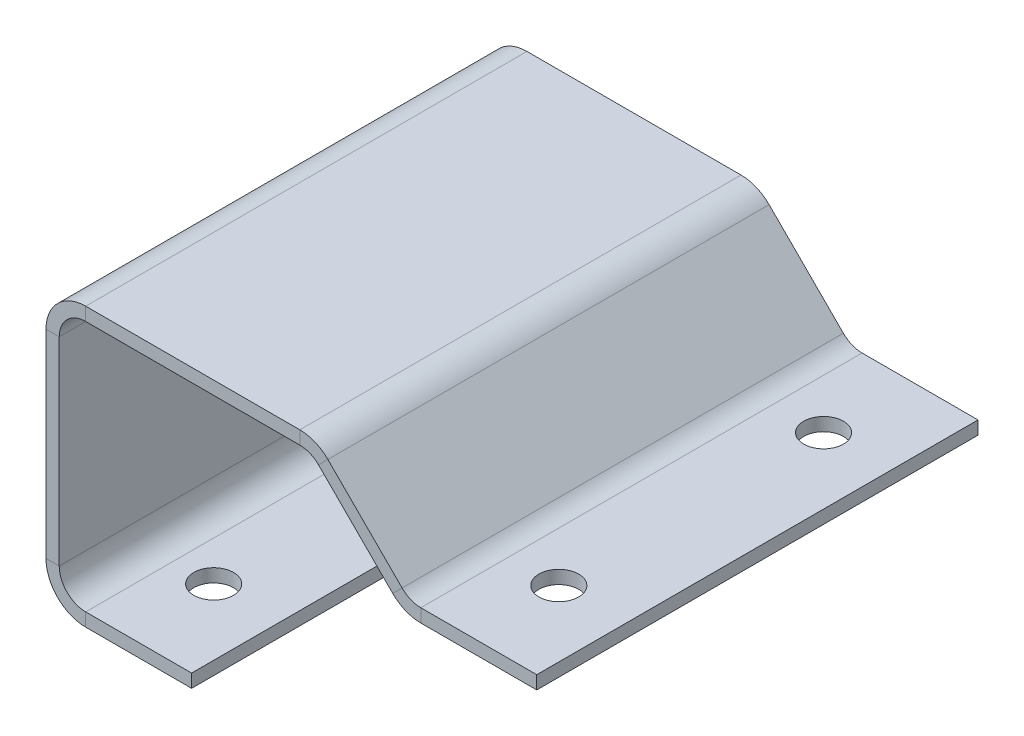
ISO-10303-21;
HEADER;
FILE_DESCRIPTION(('STEP AP214'),'2;1');
FILE_NAME('part.step','',(''),(''),'','','');
FILE_SCHEMA(('AUTOMOTIVE_DESIGN { 1 0 10303 214 1 1 1 1 }'));
ENDSEC;
DATA;
#1=APPLICATION_CONTEXT('core data for automotive mechanical design processes');
#2=APPLICATION_PROTOCOL_DEFINITION('international standard','automotive_design',2000,#1);
#3=PRODUCT_CONTEXT('',#1,'mechanical');
#4=PRODUCT('Part','Part','',(#3));
#5=PRODUCT_RELATED_PRODUCT_CATEGORY('part','',(#4));
#6=PRODUCT_DEFINITION_FORMATION('','',#4);
#7=PRODUCT_DEFINITION_CONTEXT('part definition',#1,'design');
#8=PRODUCT_DEFINITION('design','',#6,#7);
#9=PRODUCT_DEFINITION_SHAPE('','',#8);
#10=(LENGTH_UNIT() NAMED_UNIT(*) SI_UNIT(.MILLI.,.METRE.));
#11=(NAMED_UNIT(*) PLANE_ANGLE_UNIT() SI_UNIT($,.RADIAN.));
#12=(NAMED_UNIT(*) SI_UNIT($,.STERADIAN.) SOLID_ANGLE_UNIT());
#13=UNCERTAINTY_MEASURE_WITH_UNIT(LENGTH_MEASURE(1.E-05),#10,'distance_accuracy_value','');
#14=(GEOMETRIC_REPRESENTATION_CONTEXT(3) GLOBAL_UNCERTAINTY_ASSIGNED_CONTEXT((#13)) GLOBAL_UNIT_ASSIGNED_CONTEXT((#10,
#11,#12)) REPRESENTATION_CONTEXT('',''));
#15=CARTESIAN_POINT('',(0.,0.,0.));
#16=DIRECTION('',(0.,0.,1.));
#17=DIRECTION('',(1.,0.,0.));
#18=AXIS2_PLACEMENT_3D('',#15,#16,#17);
#19=CARTESIAN_POINT('',(32.2279220613579,20.8933982822021,25.));
#20=DIRECTION('',(0.,0.,-1.));
#21=DIRECTION('',(-1.,0.,0.));
#22=AXIS2_PLACEMENT_3D('',#19,#20,#21);
#23=PLANE('',#22);
#24=DIRECTION('',(-0.707106781186539,-0.707106781186556,0.));
#25=VECTOR('',#24,1.);
#26=CARTESIAN_POINT('',(31.3492424049175,21.7720779386425,25.));
#27=LINE('',#26,#25);
#28=CARTESIAN_POINT('',(31.3492424049175,21.7720779386425,25.));
#29=VERTEX_POINT('',#28);
#30=CARTESIAN_POINT('',(30.2885822331377,20.7114177668626,25.));
#31=VERTEX_POINT('',#30);
#32=EDGE_CURVE('E244',#29,#31,#27,.T.);
#33=ORIENTED_EDGE('',*,*,#32,.F.);
#34=DIRECTION('',(0.707106781186556,-0.707106781186539,0.));
#35=VECTOR('',#34,1.);
#36=CARTESIAN_POINT('',(32.2279220613579,20.8933982822021,25.));
#37=LINE('',#36,#35);
#38=CARTESIAN_POINT('',(22.9393398282201,30.1819805153397,25.));
#39=VERTEX_POINT('',#38);
#40=EDGE_CURVE('E259',#39,#29,#37,.T.);
#41=ORIENTED_EDGE('',*,*,#40,.F.);
#42=DIRECTION('',(0.707106781186539,0.707106781186556,0.));
#43=VECTOR('',#42,1.);
#44=CARTESIAN_POINT('',(21.8786796564403,29.1213203435599,25.));
#45=LINE('',#44,#43);
#46=CARTESIAN_POINT('',(21.8786796564403,29.1213203435599,25.));
#47=VERTEX_POINT('',#46);
#48=EDGE_CURVE('E250',#47,#39,#45,.T.);
#49=ORIENTED_EDGE('',*,*,#48,.F.);
#50=DIRECTION('',(0.707106781186556,-0.707106781186539,0.));
#51=VECTOR('',#50,1.);
#52=CARTESIAN_POINT('',(31.1672618895781,19.8327381104223,25.));
#53=LINE('',#52,#51);
#54=EDGE_CURVE('E258',#47,#31,#53,.T.);
#55=ORIENTED_EDGE('',*,*,#54,.T.);
#56=EDGE_LOOP('',(#33,#41,#49,#55));
#57=FACE_BOUND('',#56,.T.);
#58=ADVANCED_FACE('F48',(#57),#23,.F.);
#59=CARTESIAN_POINT('',(22.0606601717797,31.06066017178,-25.));
#60=DIRECTION('',(0.,0.,1.));
#61=DIRECTION('',(1.,0.,0.));
#62=AXIS2_PLACEMENT_3D('',#59,#60,#61);
#63=PLANE('',#62);
#64=DIRECTION('',(-0.707106781186539,-0.707106781186556,0.));
#65=VECTOR('',#64,1.);
#66=CARTESIAN_POINT('',(31.3492424049175,21.7720779386425,-25.));
#67=LINE('',#66,#65);
#68=CARTESIAN_POINT('',(31.3492424049175,21.7720779386425,-25.));
#69=VERTEX_POINT('',#68);
#70=CARTESIAN_POINT('',(30.2885822331377,20.7114177668626,-25.));
#71=VERTEX_POINT('',#70);
#72=EDGE_CURVE('E237',#69,#71,#67,.T.);
#73=ORIENTED_EDGE('',*,*,#72,.T.);
#74=DIRECTION('',(-0.707106781186556,0.707106781186539,0.));
#75=VECTOR('',#74,1.);
#76=CARTESIAN_POINT('',(20.9999999999999,30.0000000000002,-25.));
#77=LINE('',#76,#75);
#78=CARTESIAN_POINT('',(21.8786796564403,29.1213203435599,-25.));
#79=VERTEX_POINT('',#78);
#80=EDGE_CURVE('E263',#71,#79,#77,.T.);
#81=ORIENTED_EDGE('',*,*,#80,.T.);
#82=DIRECTION('',(0.707106781186539,0.707106781186556,0.));
#83=VECTOR('',#82,1.);
#84=CARTESIAN_POINT('',(21.8786796564403,29.1213203435599,-25.));
#85=LINE('',#84,#83);
#86=CARTESIAN_POINT('',(22.9393398282201,30.1819805153397,-25.));
#87=VERTEX_POINT('',#86);
#88=EDGE_CURVE('E246',#79,#87,#85,.T.);
#89=ORIENTED_EDGE('',*,*,#88,.T.);
#90=DIRECTION('',(-0.707106781186556,0.707106781186539,0.));
#91=VECTOR('',#90,1.);
#92=CARTESIAN_POINT('',(22.0606601717797,31.06066017178,-25.));
#93=LINE('',#92,#91);
#94=EDGE_CURVE('E262',#69,#87,#93,.T.);
#95=ORIENTED_EDGE('',*,*,#94,.F.);
#96=EDGE_LOOP('',(#73,#81,#89,#95));
#97=FACE_BOUND('',#96,.T.);
#98=ADVANCED_FACE('F477',(#97),#63,.F.);
#99=CARTESIAN_POINT('',(26.5606601717796,26.5606601717802,0.));
#100=DIRECTION('',(-0.707106781186539,-0.707106781186556,0.));
#101=DIRECTION('',(0.707106781186556,-0.707106781186539,0.));
#102=AXIS2_PLACEMENT_3D('',#99,#100,#101);
#103=PLANE('',#102);
#104=DIRECTION('',(0.,0.,-1.));
#105=VECTOR('',#104,1.);
#106=CARTESIAN_POINT('',(31.3492424049175,21.7720779386425,-25.));
#107=LINE('',#106,#105);
#108=EDGE_CURVE('E241',#69,#29,#107,.F.);
#109=ORIENTED_EDGE('',*,*,#108,.F.);
#110=ORIENTED_EDGE('',*,*,#94,.T.);
#111=DIRECTION('',(0.,0.,-1.));
#112=VECTOR('',#111,1.);
#113=CARTESIAN_POINT('',(22.9393398282201,30.1819805153397,0.));
#114=LINE('',#113,#112);
#115=EDGE_CURVE('E253',#39,#87,#114,.T.);
#116=ORIENTED_EDGE('',*,*,#115,.F.);
#117=ORIENTED_EDGE('',*,*,#40,.T.);
#118=EDGE_LOOP('',(#109,#110,#116,#117));
#119=FACE_BOUND('',#118,.T.);
#120=ADVANCED_FACE('F468',(#119),#103,.F.);
#121=CARTESIAN_POINT('',(25.4999999999998,25.5000000000004,0.));
#122=DIRECTION('',(-0.707106781186539,-0.707106781186556,0.));
#123=DIRECTION('',(0.707106781186556,-0.707106781186539,0.));
#124=AXIS2_PLACEMENT_3D('',#121,#122,#123);
#125=PLANE('',#124);
#126=ORIENTED_EDGE('',*,*,#80,.F.);
#127=DIRECTION('',(0.,0.,-1.));
#128=VECTOR('',#127,1.);
#129=CARTESIAN_POINT('',(30.2885822331377,20.7114177668626,-25.));
#130=LINE('',#129,#128);
#131=EDGE_CURVE('E191',#71,#31,#130,.F.);
#132=ORIENTED_EDGE('',*,*,#131,.T.);
#133=ORIENTED_EDGE('',*,*,#54,.F.);
#134=DIRECTION('',(0.,0.,1.));
#135=VECTOR('',#134,1.);
#136=CARTESIAN_POINT('',(21.8786796564403,29.1213203435599,-25.));
#137=LINE('',#136,#135);
#138=EDGE_CURVE('E248',#79,#47,#137,.T.);
#139=ORIENTED_EDGE('',*,*,#138,.F.);
#140=EDGE_LOOP('',(#126,#132,#133,#139));
#141=FACE_BOUND('',#140,.T.);
#142=ADVANCED_FACE('F461',(#141),#125,.T.);
#143=CARTESIAN_POINT('',(20.9999999999999,31.5000000000002,25.));
#144=DIRECTION('',(0.,0.,-1.));
#145=DIRECTION('',(-1.,0.,0.));
#146=AXIS2_PLACEMENT_3D('',#143,#144,#145);
#147=PLANE('',#146);
#148=DIRECTION('',(0.,1.,0.));
#149=VECTOR('',#148,1.);
#150=CARTESIAN_POINT('',(19.7573593128806,30.0000000000002,25.));
#151=LINE('',#150,#149);
#152=CARTESIAN_POINT('',(19.7573593128806,30.0000000000002,25.));
#153=VERTEX_POINT('',#152);
#154=CARTESIAN_POINT('',(19.7573593128806,31.5000000000002,25.));
#155=VERTEX_POINT('',#154);
#156=EDGE_CURVE('E275',#153,#155,#151,.T.);
#157=ORIENTED_EDGE('',*,*,#156,.T.);
#158=DIRECTION('',(1.,0.,0.));
#159=VECTOR('',#158,1.);
#160=CARTESIAN_POINT('',(20.9999999999999,31.5000000000002,25.));
#161=LINE('',#160,#159);
#162=CARTESIAN_POINT('',(-4.50000000000013,31.5,25.));
#163=VERTEX_POINT('',#162);
#164=EDGE_CURVE('E301',#163,#155,#161,.T.);
#165=ORIENTED_EDGE('',*,*,#164,.F.);
#166=DIRECTION('',(0.,1.,0.));
#167=VECTOR('',#166,1.);
#168=CARTESIAN_POINT('',(-4.50000000000012,30.,25.));
#169=LINE('',#168,#167);
#170=CARTESIAN_POINT('',(-4.50000000000012,30.,25.));
#171=VERTEX_POINT('',#170);
#172=EDGE_CURVE('E292',#171,#163,#169,.T.);
#173=ORIENTED_EDGE('',*,*,#172,.F.);
#174=DIRECTION('',(1.,0.,0.));
#175=VECTOR('',#174,1.);
#176=CARTESIAN_POINT('',(20.9999999999999,30.0000000000002,25.));
#177=LINE('',#176,#175);
#178=EDGE_CURVE('E300',#171,#153,#177,.T.);
#179=ORIENTED_EDGE('',*,*,#178,.T.);
#180=EDGE_LOOP('',(#157,#165,#173,#179));
#181=FACE_BOUND('',#180,.T.);
#182=ADVANCED_FACE('F447',(#181),#147,.F.);
#183=CARTESIAN_POINT('',(-7.50000000000011,31.5,-25.));
#184=DIRECTION('',(0.,0.,1.));
#185=DIRECTION('',(1.,0.,0.));
#186=AXIS2_PLACEMENT_3D('',#183,#184,#185);
#187=PLANE('',#186);
#188=DIRECTION('',(0.,1.,0.));
#189=VECTOR('',#188,1.);
#190=CARTESIAN_POINT('',(19.7573593128806,30.0000000000002,-25.));
#191=LINE('',#190,#189);
#192=CARTESIAN_POINT('',(19.7573593128806,30.0000000000002,-25.));
#193=VERTEX_POINT('',#192);
#194=CARTESIAN_POINT('',(19.7573593128806,31.5000000000002,-25.));
#195=VERTEX_POINT('',#194);
#196=EDGE_CURVE('E284',#193,#195,#191,.T.);
#197=ORIENTED_EDGE('',*,*,#196,.F.);
#198=DIRECTION('',(-1.,0.,0.));
#199=VECTOR('',#198,1.);
#200=CARTESIAN_POINT('',(-7.5000000000001,30.,-25.));
#201=LINE('',#200,#199);
#202=CARTESIAN_POINT('',(-4.50000000000012,30.,-25.));
#203=VERTEX_POINT('',#202);
#204=EDGE_CURVE('E304',#193,#203,#201,.T.);
#205=ORIENTED_EDGE('',*,*,#204,.T.);
#206=DIRECTION('',(0.,1.,0.));
#207=VECTOR('',#206,1.);
#208=CARTESIAN_POINT('',(-4.50000000000012,30.,-25.));
#209=LINE('',#208,#207);
#210=CARTESIAN_POINT('',(-4.50000000000013,31.5,-25.));
#211=VERTEX_POINT('',#210);
#212=EDGE_CURVE('E287',#203,#211,#209,.T.);
#213=ORIENTED_EDGE('',*,*,#212,.T.);
#214=DIRECTION('',(-1.,0.,0.));
#215=VECTOR('',#214,1.);
#216=CARTESIAN_POINT('',(-7.50000000000011,31.5,-25.));
#217=LINE('',#216,#215);
#218=EDGE_CURVE('E303',#195,#211,#217,.T.);
#219=ORIENTED_EDGE('',*,*,#218,.F.);
#220=EDGE_LOOP('',(#197,#205,#213,#219));
#221=FACE_BOUND('',#220,.T.);
#222=ADVANCED_FACE('F543',(#221),#187,.F.);
#223=CARTESIAN_POINT('',(-2.18653860171201E-13,31.5000000000001,0.));
#224=DIRECTION('',(0.,-1.,0.));
#225=DIRECTION('',(1.,0.,0.));
#226=AXIS2_PLACEMENT_3D('',#223,#224,#225);
#227=PLANE('',#226);
#228=DIRECTION('',(0.,0.,1.));
#229=VECTOR('',#228,1.);
#230=CARTESIAN_POINT('',(19.7573593128806,31.5000000000002,25.));
#231=LINE('',#230,#229);
#232=EDGE_CURVE('E269',#155,#195,#231,.F.);
#233=ORIENTED_EDGE('',*,*,#232,.T.);
#234=ORIENTED_EDGE('',*,*,#218,.T.);
#235=DIRECTION('',(0.,0.,-1.));
#236=VECTOR('',#235,1.);
#237=CARTESIAN_POINT('',(-4.50000000000013,31.5,0.));
#238=LINE('',#237,#236);
#239=EDGE_CURVE('E295',#163,#211,#238,.T.);
#240=ORIENTED_EDGE('',*,*,#239,.F.);
#241=ORIENTED_EDGE('',*,*,#164,.T.);
#242=EDGE_LOOP('',(#233,#234,#240,#241));
#243=FACE_BOUND('',#242,.T.);
#244=ADVANCED_FACE('F540',(#243),#227,.F.);
#245=CARTESIAN_POINT('',(-2.08166817117217E-13,30.0000000000001,0.));
#246=DIRECTION('',(0.,-1.,0.));
#247=DIRECTION('',(1.,0.,0.));
#248=AXIS2_PLACEMENT_3D('',#245,#246,#247);
#249=PLANE('',#248);
#250=ORIENTED_EDGE('',*,*,#204,.F.);
#251=DIRECTION('',(0.,0.,1.));
#252=VECTOR('',#251,1.);
#253=CARTESIAN_POINT('',(19.7573593128806,30.0000000000002,25.));
#254=LINE('',#253,#252);
#255=EDGE_CURVE('E71',#153,#193,#254,.F.);
#256=ORIENTED_EDGE('',*,*,#255,.F.);
#257=ORIENTED_EDGE('',*,*,#178,.F.);
#258=DIRECTION('',(0.,0.,1.));
#259=VECTOR('',#258,1.);
#260=CARTESIAN_POINT('',(-4.50000000000012,30.,-25.));
#261=LINE('',#260,#259);
#262=EDGE_CURVE('E290',#203,#171,#261,.T.);
#263=ORIENTED_EDGE('',*,*,#262,.F.);
#264=EDGE_LOOP('',(#250,#256,#257,#263));
#265=FACE_BOUND('',#264,.T.);
#266=ADVANCED_FACE('F444',(#265),#249,.T.);
#267=CARTESIAN_POINT('',(-9.0000000000001,30.,25.));
#268=DIRECTION('',(0.,0.,-1.));
#269=DIRECTION('',(-1.,0.,0.));
#270=AXIS2_PLACEMENT_3D('',#267,#268,#269);
#271=PLANE('',#270);
#272=DIRECTION('',(-1.,0.,0.));
#273=VECTOR('',#272,1.);
#274=CARTESIAN_POINT('',(-7.50000000000009,27.,25.));
#275=LINE('',#274,#273);
#276=CARTESIAN_POINT('',(-7.50000000000009,27.,25.));
#277=VERTEX_POINT('',#276);
#278=CARTESIAN_POINT('',(-9.00000000000009,27.,25.));
#279=VERTEX_POINT('',#278);
#280=EDGE_CURVE('E315',#277,#279,#275,.T.);
#281=ORIENTED_EDGE('',*,*,#280,.T.);
#282=DIRECTION('',(0.,1.,0.));
#283=VECTOR('',#282,1.);
#284=CARTESIAN_POINT('',(-9.0000000000001,30.,25.));
#285=LINE('',#284,#283);
#286=CARTESIAN_POINT('',(-9.00000000000001,4.49999999999999,25.));
#287=VERTEX_POINT('',#286);
#288=EDGE_CURVE('E343',#287,#279,#285,.T.);
#289=ORIENTED_EDGE('',*,*,#288,.F.);
#290=DIRECTION('',(-1.,0.,0.));
#291=VECTOR('',#290,1.);
#292=CARTESIAN_POINT('',(-7.50000000000001,4.49999999999999,25.));
#293=LINE('',#292,#291);
#294=CARTESIAN_POINT('',(-7.50000000000001,4.49999999999999,25.));
#295=VERTEX_POINT('',#294);
#296=EDGE_CURVE('E334',#295,#287,#293,.T.);
#297=ORIENTED_EDGE('',*,*,#296,.F.);
#298=DIRECTION('',(0.,1.,0.));
#299=VECTOR('',#298,1.);
#300=CARTESIAN_POINT('',(-7.5000000000001,30.,25.));
#301=LINE('',#300,#299);
#302=EDGE_CURVE('E342',#295,#277,#301,.T.);
#303=ORIENTED_EDGE('',*,*,#302,.T.);
#304=EDGE_LOOP('',(#281,#289,#297,#303));
#305=FACE_BOUND('',#304,.T.);
#306=ADVANCED_FACE('F433',(#305),#271,.F.);
#307=CARTESIAN_POINT('',(-9.,1.49999999999999,-25.));
#308=DIRECTION('',(0.,0.,1.));
#309=DIRECTION('',(1.,0.,0.));
#310=AXIS2_PLACEMENT_3D('',#307,#308,#309);
#311=PLANE('',#310);
#312=DIRECTION('',(-1.,0.,0.));
#313=VECTOR('',#312,1.);
#314=CARTESIAN_POINT('',(-7.50000000000009,27.,-25.));
#315=LINE('',#314,#313);
#316=CARTESIAN_POINT('',(-7.50000000000009,27.,-25.));
#317=VERTEX_POINT('',#316);
#318=CARTESIAN_POINT('',(-9.0000000000001,27.,-25.));
#319=VERTEX_POINT('',#318);
#320=EDGE_CURVE('E326',#317,#319,#315,.T.);
#321=ORIENTED_EDGE('',*,*,#320,.F.);
#322=DIRECTION('',(0.,-1.,0.));
#323=VECTOR('',#322,1.);
#324=CARTESIAN_POINT('',(-7.5,1.5,-25.));
#325=LINE('',#324,#323);
#326=CARTESIAN_POINT('',(-7.50000000000001,4.49999999999999,-25.));
#327=VERTEX_POINT('',#326);
#328=EDGE_CURVE('E346',#317,#327,#325,.T.);
#329=ORIENTED_EDGE('',*,*,#328,.T.);
#330=DIRECTION('',(-1.,0.,0.));
#331=VECTOR('',#330,1.);
#332=CARTESIAN_POINT('',(-7.50000000000001,4.49999999999999,-25.));
#333=LINE('',#332,#331);
#334=CARTESIAN_POINT('',(-9.00000000000001,4.49999999999999,-25.));
#335=VERTEX_POINT('',#334);
#336=EDGE_CURVE('E329',#327,#335,#333,.T.);
#337=ORIENTED_EDGE('',*,*,#336,.T.);
#338=DIRECTION('',(0.,-1.,0.));
#339=VECTOR('',#338,1.);
#340=CARTESIAN_POINT('',(-9.,1.49999999999999,-25.));
#341=LINE('',#340,#339);
#342=EDGE_CURVE('E345',#319,#335,#341,.T.);
#343=ORIENTED_EDGE('',*,*,#342,.F.);
#344=EDGE_LOOP('',(#321,#329,#337,#343));
#345=FACE_BOUND('',#344,.T.);
#346=ADVANCED_FACE('F567',(#345),#311,.F.);
#347=CARTESIAN_POINT('',(-9.,0.,0.));
#348=DIRECTION('',(1.,0.,0.));
#349=DIRECTION('',(0.,1.,0.));
#350=AXIS2_PLACEMENT_3D('',#347,#348,#349);
#351=PLANE('',#350);
#352=DIRECTION('',(0.,0.,1.));
#353=VECTOR('',#352,1.);
#354=CARTESIAN_POINT('',(-9.00000000000009,27.,25.));
#355=LINE('',#354,#353);
#356=EDGE_CURVE('E309',#279,#319,#355,.F.);
#357=ORIENTED_EDGE('',*,*,#356,.T.);
#358=ORIENTED_EDGE('',*,*,#342,.T.);
#359=DIRECTION('',(0.,0.,-1.));
#360=VECTOR('',#359,1.);
#361=CARTESIAN_POINT('',(-9.00000000000001,4.49999999999999,0.));
#362=LINE('',#361,#360);
#363=EDGE_CURVE('E337',#287,#335,#362,.T.);
#364=ORIENTED_EDGE('',*,*,#363,.F.);
#365=ORIENTED_EDGE('',*,*,#288,.T.);
#366=EDGE_LOOP('',(#357,#358,#364,#365));
#367=FACE_BOUND('',#366,.T.);
#368=ADVANCED_FACE('F564',(#367),#351,.F.);
#369=CARTESIAN_POINT('',(-7.5,0.,0.));
#370=DIRECTION('',(1.,0.,0.));
#371=DIRECTION('',(0.,1.,0.));
#372=AXIS2_PLACEMENT_3D('',#369,#370,#371);
#373=PLANE('',#372);
#374=ORIENTED_EDGE('',*,*,#328,.F.);
#375=DIRECTION('',(0.,0.,1.));
#376=VECTOR('',#375,1.);
#377=CARTESIAN_POINT('',(-7.50000000000009,27.,25.));
#378=LINE('',#377,#376);
#379=EDGE_CURVE('E321',#277,#317,#378,.F.);
#380=ORIENTED_EDGE('',*,*,#379,.F.);
#381=ORIENTED_EDGE('',*,*,#302,.F.);
#382=DIRECTION('',(0.,0.,1.));
#383=VECTOR('',#382,1.);
#384=CARTESIAN_POINT('',(-7.50000000000001,4.49999999999999,-25.));
#385=LINE('',#384,#383);
#386=EDGE_CURVE('E332',#327,#295,#385,.T.);
#387=ORIENTED_EDGE('',*,*,#386,.F.);
#388=EDGE_LOOP('',(#374,#380,#381,#387));
#389=FACE_BOUND('',#388,.T.);
#390=ADVANCED_FACE('F430',(#389),#373,.T.);
#391=CARTESIAN_POINT('',(0.,1.5,0.));
#392=DIRECTION('',(0.,-1.,0.));
#393=DIRECTION('',(0.,0.,-1.));
#394=AXIS2_PLACEMENT_3D('',#391,#392,#393);
#395=PLANE('',#394);
#396=CARTESIAN_POINT('',(0.,1.5,15.));
#397=DIRECTION('',(0.,1.,0.));
#398=DIRECTION('',(0.,0.,1.));
#399=AXIS2_PLACEMENT_3D('',#396,#397,#398);
#400=CIRCLE('',#399,2.25);
#401=CARTESIAN_POINT('',(0.,1.5,17.25));
#402=VERTEX_POINT('',#401);
#403=EDGE_CURVE('E375',#402,#402,#400,.T.);
#404=ORIENTED_EDGE('',*,*,#403,.F.);
#405=EDGE_LOOP('',(#404));
#406=FACE_BOUND('',#405,.T.);
#407=CARTESIAN_POINT('',(0.,1.5,-15.));
#408=DIRECTION('',(0.,1.,0.));
#409=DIRECTION('',(0.,0.,1.));
#410=AXIS2_PLACEMENT_3D('',#407,#408,#409);
#411=CIRCLE('',#410,2.25);
#412=CARTESIAN_POINT('',(0.,1.5,-12.75));
#413=VERTEX_POINT('',#412);
#414=EDGE_CURVE('E381',#413,#413,#411,.T.);
#415=ORIENTED_EDGE('',*,*,#414,.F.);
#416=EDGE_LOOP('',(#415));
#417=FACE_BOUND('',#416,.T.);
#418=DIRECTION('',(0.,0.,1.));
#419=VECTOR('',#418,1.);
#420=CARTESIAN_POINT('',(-4.50000000000001,1.5,25.));
#421=LINE('',#420,#419);
#422=CARTESIAN_POINT('',(-4.50000000000001,1.5,25.));
#423=VERTEX_POINT('',#422);
#424=CARTESIAN_POINT('',(-4.50000000000001,1.5,-25.));
#425=VERTEX_POINT('',#424);
#426=EDGE_CURVE('E365',#423,#425,#421,.F.);
#427=ORIENTED_EDGE('',*,*,#426,.F.);
#428=DIRECTION('',(1.,0.,0.));
#429=VECTOR('',#428,1.);
#430=CARTESIAN_POINT('',(-7.5,1.5,25.));
#431=LINE('',#430,#429);
#432=CARTESIAN_POINT('',(7.5,1.5,25.));
#433=VERTEX_POINT('',#432);
#434=EDGE_CURVE('E394',#423,#433,#431,.T.);
#435=ORIENTED_EDGE('',*,*,#434,.T.);
#436=DIRECTION('',(0.,0.,-1.));
#437=VECTOR('',#436,1.);
#438=CARTESIAN_POINT('',(7.5,1.5,25.));
#439=LINE('',#438,#437);
#440=CARTESIAN_POINT('',(7.5,1.5,-25.));
#441=VERTEX_POINT('',#440);
#442=EDGE_CURVE('E387',#433,#441,#439,.T.);
#443=ORIENTED_EDGE('',*,*,#442,.T.);
#444=DIRECTION('',(-1.,0.,0.));
#445=VECTOR('',#444,1.);
#446=CARTESIAN_POINT('',(-7.5,1.5,-25.));
#447=LINE('',#446,#445);
#448=EDGE_CURVE('E390',#441,#425,#447,.T.);
#449=ORIENTED_EDGE('',*,*,#448,.T.);
#450=EDGE_LOOP('',(#427,#435,#443,#449));
#451=FACE_BOUND('',#450,.T.);
#452=ADVANCED_FACE('F417',(#406,#417,#451),#395,.F.);
#453=CARTESIAN_POINT('',(0.,0.,0.));
#454=DIRECTION('',(0.,-1.,0.));
#455=DIRECTION('',(0.,0.,-1.));
#456=AXIS2_PLACEMENT_3D('',#453,#454,#455);
#457=PLANE('',#456);
#458=CARTESIAN_POINT('',(0.,0.,-15.));
#459=DIRECTION('',(0.,1.,0.));
#460=DIRECTION('',(0.,0.,1.));
#461=AXIS2_PLACEMENT_3D('',#458,#459,#460);
#462=CIRCLE('',#461,2.25);
#463=CARTESIAN_POINT('',(0.,0.,-12.75));
#464=VERTEX_POINT('',#463);
#465=EDGE_CURVE('E378',#464,#464,#462,.T.);
#466=ORIENTED_EDGE('',*,*,#465,.T.);
#467=EDGE_LOOP('',(#466));
#468=FACE_BOUND('',#467,.T.);
#469=CARTESIAN_POINT('',(0.,0.,15.));
#470=DIRECTION('',(0.,1.,0.));
#471=DIRECTION('',(0.,0.,1.));
#472=AXIS2_PLACEMENT_3D('',#469,#470,#471);
#473=CIRCLE('',#472,2.25);
#474=CARTESIAN_POINT('',(0.,0.,17.25));
#475=VERTEX_POINT('',#474);
#476=EDGE_CURVE('E372',#475,#475,#473,.T.);
#477=ORIENTED_EDGE('',*,*,#476,.T.);
#478=EDGE_LOOP('',(#477));
#479=FACE_BOUND('',#478,.T.);
#480=DIRECTION('',(1.,0.,0.));
#481=VECTOR('',#480,1.);
#482=CARTESIAN_POINT('',(-7.5,0.,25.));
#483=LINE('',#482,#481);
#484=CARTESIAN_POINT('',(-4.50000000000001,0.,25.));
#485=VERTEX_POINT('',#484);
#486=CARTESIAN_POINT('',(7.5,0.,25.));
#487=VERTEX_POINT('',#486);
#488=EDGE_CURVE('E391',#485,#487,#483,.T.);
#489=ORIENTED_EDGE('',*,*,#488,.F.);
#490=DIRECTION('',(0.,0.,1.));
#491=VECTOR('',#490,1.);
#492=CARTESIAN_POINT('',(-4.50000000000001,0.,25.));
#493=LINE('',#492,#491);
#494=CARTESIAN_POINT('',(-4.50000000000001,0.,-25.));
#495=VERTEX_POINT('',#494);
#496=EDGE_CURVE('E352',#485,#495,#493,.F.);
#497=ORIENTED_EDGE('',*,*,#496,.T.);
#498=DIRECTION('',(-1.,0.,0.));
#499=VECTOR('',#498,1.);
#500=CARTESIAN_POINT('',(-7.5,0.,-25.));
#501=LINE('',#500,#499);
#502=CARTESIAN_POINT('',(7.5,0.,-25.));
#503=VERTEX_POINT('',#502);
#504=EDGE_CURVE('E398',#503,#495,#501,.T.);
#505=ORIENTED_EDGE('',*,*,#504,.F.);
#506=DIRECTION('',(0.,0.,-1.));
#507=VECTOR('',#506,1.);
#508=CARTESIAN_POINT('',(7.5,0.,25.));
#509=LINE('',#508,#507);
#510=EDGE_CURVE('E384',#487,#503,#509,.T.);
#511=ORIENTED_EDGE('',*,*,#510,.F.);
#512=EDGE_LOOP('',(#489,#497,#505,#511));
#513=FACE_BOUND('',#512,.T.);
#514=ADVANCED_FACE('F411',(#468,#479,#513),#457,.T.);
#515=CARTESIAN_POINT('',(-7.5,1.5,-25.));
#516=DIRECTION('',(0.,0.,1.));
#517=DIRECTION('',(1.,0.,0.));
#518=AXIS2_PLACEMENT_3D('',#515,#516,#517);
#519=PLANE('',#518);
#520=DIRECTION('',(0.,-1.,0.));
#521=VECTOR('',#520,1.);
#522=CARTESIAN_POINT('',(-4.50000000000001,1.5,-25.));
#523=LINE('',#522,#521);
#524=EDGE_CURVE('E369',#425,#495,#523,.T.);
#525=ORIENTED_EDGE('',*,*,#524,.F.);
#526=ORIENTED_EDGE('',*,*,#448,.F.);
#527=DIRECTION('',(0.,-1.,0.));
#528=VECTOR('',#527,1.);
#529=CARTESIAN_POINT('',(7.5,1.5,-25.));
#530=LINE('',#529,#528);
#531=EDGE_CURVE('E13',#441,#503,#530,.T.);
#532=ORIENTED_EDGE('',*,*,#531,.T.);
#533=ORIENTED_EDGE('',*,*,#504,.T.);
#534=EDGE_LOOP('',(#525,#526,#532,#533));
#535=FACE_BOUND('',#534,.T.);
#536=ADVANCED_FACE('F414',(#535),#519,.F.);
#537=CARTESIAN_POINT('',(-7.5,1.5,25.));
#538=DIRECTION('',(0.,0.,-1.));
#539=DIRECTION('',(-1.,0.,0.));
#540=AXIS2_PLACEMENT_3D('',#537,#538,#539);
#541=PLANE('',#540);
#542=DIRECTION('',(0.,-1.,0.));
#543=VECTOR('',#542,1.);
#544=CARTESIAN_POINT('',(-4.50000000000001,1.5,25.));
#545=LINE('',#544,#543);
#546=EDGE_CURVE('E359',#423,#485,#545,.T.);
#547=ORIENTED_EDGE('',*,*,#546,.T.);
#548=ORIENTED_EDGE('',*,*,#488,.T.);
#549=DIRECTION('',(0.,-1.,0.));
#550=VECTOR('',#549,1.);
#551=CARTESIAN_POINT('',(7.5,1.5,25.));
#552=LINE('',#551,#550);
#553=EDGE_CURVE('E56',#433,#487,#552,.T.);
#554=ORIENTED_EDGE('',*,*,#553,.F.);
#555=ORIENTED_EDGE('',*,*,#434,.F.);
#556=EDGE_LOOP('',(#547,#548,#554,#555));
#557=FACE_BOUND('',#556,.T.);
#558=ADVANCED_FACE('F418',(#557),#541,.F.);
#559=CARTESIAN_POINT('',(7.5,1.5,25.));
#560=DIRECTION('',(-1.,0.,0.));
#561=DIRECTION('',(0.,0.,1.));
#562=AXIS2_PLACEMENT_3D('',#559,#560,#561);
#563=PLANE('',#562);
#564=ORIENTED_EDGE('',*,*,#510,.T.);
#565=ORIENTED_EDGE('',*,*,#531,.F.);
#566=ORIENTED_EDGE('',*,*,#442,.F.);
#567=ORIENTED_EDGE('',*,*,#553,.T.);
#568=EDGE_LOOP('',(#564,#565,#566,#567));
#569=FACE_BOUND('',#568,.T.);
#570=ADVANCED_FACE('F50',(#569),#563,.F.);
#571=CARTESIAN_POINT('',(0.,1.5,-15.));
#572=DIRECTION('',(0.,-1.,0.));
#573=DIRECTION('',(0.,0.,-1.));
#574=AXIS2_PLACEMENT_3D('',#571,#572,#573);
#575=CYLINDRICAL_SURFACE('',#574,2.25);
#576=ORIENTED_EDGE('',*,*,#414,.T.);
#577=EDGE_LOOP('',(#576));
#578=FACE_BOUND('',#577,.T.);
#579=ORIENTED_EDGE('',*,*,#465,.F.);
#580=EDGE_LOOP('',(#579));
#581=FACE_BOUND('',#580,.T.);
#582=ADVANCED_FACE('F591',(#578,#581),#575,.F.);
#583=CARTESIAN_POINT('',(0.,1.5,15.));
#584=DIRECTION('',(0.,-1.,0.));
#585=DIRECTION('',(0.,0.,-1.));
#586=AXIS2_PLACEMENT_3D('',#583,#584,#585);
#587=CYLINDRICAL_SURFACE('',#586,2.25);
#588=ORIENTED_EDGE('',*,*,#403,.T.);
#589=EDGE_LOOP('',(#588));
#590=FACE_BOUND('',#589,.T.);
#591=ORIENTED_EDGE('',*,*,#476,.F.);
#592=EDGE_LOOP('',(#591));
#593=FACE_BOUND('',#592,.T.);
#594=ADVANCED_FACE('F585',(#590,#593),#587,.F.);
#595=CARTESIAN_POINT('',(-4.50000000000001,4.5,-25.));
#596=DIRECTION('',(0.,0.,-1.));
#597=DIRECTION('',(-1.,0.,0.));
#598=AXIS2_PLACEMENT_3D('',#595,#596,#597);
#599=PLANE('',#598);
#600=ORIENTED_EDGE('',*,*,#336,.F.);
#601=CARTESIAN_POINT('',(-4.50000000000001,4.5,-25.));
#602=DIRECTION('',(0.,0.,1.));
#603=DIRECTION('',(1.,0.,0.));
#604=AXIS2_PLACEMENT_3D('',#601,#602,#603);
#605=CIRCLE('',#604,3.);
#606=EDGE_CURVE('E362',#425,#327,#605,.F.);
#607=ORIENTED_EDGE('',*,*,#606,.F.);
#608=ORIENTED_EDGE('',*,*,#524,.T.);
#609=CARTESIAN_POINT('',(-4.50000000000001,4.5,-25.));
#610=DIRECTION('',(0.,0.,1.));
#611=DIRECTION('',(1.,0.,0.));
#612=AXIS2_PLACEMENT_3D('',#609,#610,#611);
#613=CIRCLE('',#612,4.5);
#614=EDGE_CURVE('E355',#495,#335,#613,.F.);
#615=ORIENTED_EDGE('',*,*,#614,.T.);
#616=EDGE_LOOP('',(#600,#607,#608,#615));
#617=FACE_BOUND('',#616,.T.);
#618=ADVANCED_FACE('F582',(#617),#599,.T.);
#619=CARTESIAN_POINT('',(-4.50000000000001,4.5,25.));
#620=DIRECTION('',(0.,0.,-1.));
#621=DIRECTION('',(-1.,0.,0.));
#622=AXIS2_PLACEMENT_3D('',#619,#620,#621);
#623=PLANE('',#622);
#624=CARTESIAN_POINT('',(-4.50000000000001,4.5,25.));
#625=DIRECTION('',(0.,0.,1.));
#626=DIRECTION('',(1.,0.,0.));
#627=AXIS2_PLACEMENT_3D('',#624,#625,#626);
#628=CIRCLE('',#627,3.);
#629=EDGE_CURVE('E348',#295,#423,#628,.T.);
#630=ORIENTED_EDGE('',*,*,#629,.F.);
#631=ORIENTED_EDGE('',*,*,#296,.T.);
#632=CARTESIAN_POINT('',(-4.50000000000001,4.5,25.));
#633=DIRECTION('',(0.,0.,1.));
#634=DIRECTION('',(1.,0.,0.));
#635=AXIS2_PLACEMENT_3D('',#632,#633,#634);
#636=CIRCLE('',#635,4.5);
#637=EDGE_CURVE('E356',#287,#485,#636,.T.);
#638=ORIENTED_EDGE('',*,*,#637,.T.);
#639=ORIENTED_EDGE('',*,*,#546,.F.);
#640=EDGE_LOOP('',(#630,#631,#638,#639));
#641=FACE_BOUND('',#640,.T.);
#642=ADVANCED_FACE('F421',(#641),#623,.F.);
#643=CARTESIAN_POINT('',(-4.50000000000001,4.5,25.));
#644=DIRECTION('',(0.,0.,1.));
#645=DIRECTION('',(-1.,0.,0.));
#646=AXIS2_PLACEMENT_3D('',#643,#644,#645);
#647=CYLINDRICAL_SURFACE('',#646,4.5);
#648=ORIENTED_EDGE('',*,*,#496,.F.);
#649=ORIENTED_EDGE('',*,*,#637,.F.);
#650=ORIENTED_EDGE('',*,*,#363,.T.);
#651=ORIENTED_EDGE('',*,*,#614,.F.);
#652=EDGE_LOOP('',(#648,#649,#650,#651));
#653=FACE_BOUND('',#652,.T.);
#654=ADVANCED_FACE('F576',(#653),#647,.T.);
#655=CARTESIAN_POINT('',(-4.50000000000001,4.5,25.));
#656=DIRECTION('',(0.,0.,1.));
#657=DIRECTION('',(-1.,0.,0.));
#658=AXIS2_PLACEMENT_3D('',#655,#656,#657);
#659=CYLINDRICAL_SURFACE('',#658,3.);
#660=ORIENTED_EDGE('',*,*,#426,.T.);
#661=ORIENTED_EDGE('',*,*,#606,.T.);
#662=ORIENTED_EDGE('',*,*,#386,.T.);
#663=ORIENTED_EDGE('',*,*,#629,.T.);
#664=EDGE_LOOP('',(#660,#661,#662,#663));
#665=FACE_BOUND('',#664,.T.);
#666=ADVANCED_FACE('F424',(#665),#659,.F.);
#667=CARTESIAN_POINT('',(-4.50000000000009,27.,-25.));
#668=DIRECTION('',(0.,0.,-1.));
#669=DIRECTION('',(-1.,0.,0.));
#670=AXIS2_PLACEMENT_3D('',#667,#668,#669);
#671=PLANE('',#670);
#672=ORIENTED_EDGE('',*,*,#212,.F.);
#673=CARTESIAN_POINT('',(-4.50000000000009,27.,-25.));
#674=DIRECTION('',(0.,0.,1.));
#675=DIRECTION('',(1.,0.,0.));
#676=AXIS2_PLACEMENT_3D('',#673,#674,#675);
#677=CIRCLE('',#676,3.);
#678=EDGE_CURVE('E318',#317,#203,#677,.F.);
#679=ORIENTED_EDGE('',*,*,#678,.F.);
#680=ORIENTED_EDGE('',*,*,#320,.T.);
#681=CARTESIAN_POINT('',(-4.50000000000009,27.,-25.));
#682=DIRECTION('',(0.,0.,1.));
#683=DIRECTION('',(1.,0.,0.));
#684=AXIS2_PLACEMENT_3D('',#681,#682,#683);
#685=CIRCLE('',#684,4.5);
#686=EDGE_CURVE('E311',#319,#211,#685,.F.);
#687=ORIENTED_EDGE('',*,*,#686,.T.);
#688=EDGE_LOOP('',(#672,#679,#680,#687));
#689=FACE_BOUND('',#688,.T.);
#690=ADVANCED_FACE('F558',(#689),#671,.T.);
#691=CARTESIAN_POINT('',(-4.50000000000009,27.,25.));
#692=DIRECTION('',(0.,0.,-1.));
#693=DIRECTION('',(-1.,0.,0.));
#694=AXIS2_PLACEMENT_3D('',#691,#692,#693);
#695=PLANE('',#694);
#696=CARTESIAN_POINT('',(-4.50000000000009,27.,25.));
#697=DIRECTION('',(0.,0.,1.));
#698=DIRECTION('',(1.,0.,0.));
#699=AXIS2_PLACEMENT_3D('',#696,#697,#698);
#700=CIRCLE('',#699,3.);
#701=EDGE_CURVE('E306',#171,#277,#700,.T.);
#702=ORIENTED_EDGE('',*,*,#701,.F.);
#703=ORIENTED_EDGE('',*,*,#172,.T.);
#704=CARTESIAN_POINT('',(-4.50000000000009,27.,25.));
#705=DIRECTION('',(0.,0.,1.));
#706=DIRECTION('',(1.,0.,0.));
#707=AXIS2_PLACEMENT_3D('',#704,#705,#706);
#708=CIRCLE('',#707,4.5);
#709=EDGE_CURVE('E312',#163,#279,#708,.T.);
#710=ORIENTED_EDGE('',*,*,#709,.T.);
#711=ORIENTED_EDGE('',*,*,#280,.F.);
#712=EDGE_LOOP('',(#702,#703,#710,#711));
#713=FACE_BOUND('',#712,.T.);
#714=ADVANCED_FACE('F438',(#713),#695,.F.);
#715=CARTESIAN_POINT('',(-4.50000000000009,27.,25.));
#716=DIRECTION('',(0.,0.,1.));
#717=DIRECTION('',(0.,1.,0.));
#718=AXIS2_PLACEMENT_3D('',#715,#716,#717);
#719=CYLINDRICAL_SURFACE('',#718,4.5);
#720=ORIENTED_EDGE('',*,*,#356,.F.);
#721=ORIENTED_EDGE('',*,*,#709,.F.);
#722=ORIENTED_EDGE('',*,*,#239,.T.);
#723=ORIENTED_EDGE('',*,*,#686,.F.);
#724=EDGE_LOOP('',(#720,#721,#722,#723));
#725=FACE_BOUND('',#724,.T.);
#726=ADVANCED_FACE('F552',(#725),#719,.T.);
#727=CARTESIAN_POINT('',(-4.50000000000009,27.,25.));
#728=DIRECTION('',(0.,0.,1.));
#729=DIRECTION('',(0.,1.,0.));
#730=AXIS2_PLACEMENT_3D('',#727,#728,#729);
#731=CYLINDRICAL_SURFACE('',#730,3.);
#732=ORIENTED_EDGE('',*,*,#379,.T.);
#733=ORIENTED_EDGE('',*,*,#678,.T.);
#734=ORIENTED_EDGE('',*,*,#262,.T.);
#735=ORIENTED_EDGE('',*,*,#701,.T.);
#736=EDGE_LOOP('',(#732,#733,#734,#735));
#737=FACE_BOUND('',#736,.T.);
#738=ADVANCED_FACE('F441',(#737),#731,.F.);
#739=CARTESIAN_POINT('',(19.7573593128806,27.0000000000002,-25.));
#740=DIRECTION('',(0.,0.,-1.));
#741=DIRECTION('',(-1.,0.,0.));
#742=AXIS2_PLACEMENT_3D('',#739,#740,#741);
#743=PLANE('',#742);
#744=ORIENTED_EDGE('',*,*,#88,.F.);
#745=CARTESIAN_POINT('',(19.7573593128806,27.0000000000002,-25.));
#746=DIRECTION('',(0.,0.,1.));
#747=DIRECTION('',(1.,0.,0.));
#748=AXIS2_PLACEMENT_3D('',#745,#746,#747);
#749=CIRCLE('',#748,3.);
#750=EDGE_CURVE('E278',#193,#79,#749,.F.);
#751=ORIENTED_EDGE('',*,*,#750,.F.);
#752=ORIENTED_EDGE('',*,*,#196,.T.);
#753=CARTESIAN_POINT('',(19.7573593128806,27.0000000000002,-25.));
#754=DIRECTION('',(0.,0.,1.));
#755=DIRECTION('',(1.,0.,0.));
#756=AXIS2_PLACEMENT_3D('',#753,#754,#755);
#757=CIRCLE('',#756,4.5);
#758=EDGE_CURVE('E271',#195,#87,#757,.F.);
#759=ORIENTED_EDGE('',*,*,#758,.T.);
#760=EDGE_LOOP('',(#744,#751,#752,#759));
#761=FACE_BOUND('',#760,.T.);
#762=ADVANCED_FACE('F475',(#761),#743,.T.);
#763=CARTESIAN_POINT('',(19.7573593128806,27.0000000000002,25.));
#764=DIRECTION('',(0.,0.,-1.));
#765=DIRECTION('',(-1.,0.,0.));
#766=AXIS2_PLACEMENT_3D('',#763,#764,#765);
#767=PLANE('',#766);
#768=CARTESIAN_POINT('',(19.7573593128806,27.0000000000002,25.));
#769=DIRECTION('',(0.,0.,1.));
#770=DIRECTION('',(1.,0.,0.));
#771=AXIS2_PLACEMENT_3D('',#768,#769,#770);
#772=CIRCLE('',#771,3.);
#773=EDGE_CURVE('E265',#47,#153,#772,.T.);
#774=ORIENTED_EDGE('',*,*,#773,.F.);
#775=ORIENTED_EDGE('',*,*,#48,.T.);
#776=CARTESIAN_POINT('',(19.7573593128806,27.0000000000002,25.));
#777=DIRECTION('',(0.,0.,1.));
#778=DIRECTION('',(1.,0.,0.));
#779=AXIS2_PLACEMENT_3D('',#776,#777,#778);
#780=CIRCLE('',#779,4.5);
#781=EDGE_CURVE('E272',#39,#155,#780,.T.);
#782=ORIENTED_EDGE('',*,*,#781,.T.);
#783=ORIENTED_EDGE('',*,*,#156,.F.);
#784=EDGE_LOOP('',(#774,#775,#782,#783));
#785=FACE_BOUND('',#784,.T.);
#786=ADVANCED_FACE('F452',(#785),#767,.F.);
#787=CARTESIAN_POINT('',(19.7573593128806,27.0000000000002,25.));
#788=DIRECTION('',(0.,0.,1.));
#789=DIRECTION('',(0.707106781186539,0.707106781186556,0.));
#790=AXIS2_PLACEMENT_3D('',#787,#788,#789);
#791=CYLINDRICAL_SURFACE('',#790,4.5);
#792=ORIENTED_EDGE('',*,*,#232,.F.);
#793=ORIENTED_EDGE('',*,*,#781,.F.);
#794=ORIENTED_EDGE('',*,*,#115,.T.);
#795=ORIENTED_EDGE('',*,*,#758,.F.);
#796=EDGE_LOOP('',(#792,#793,#794,#795));
#797=FACE_BOUND('',#796,.T.);
#798=ADVANCED_FACE('F472',(#797),#791,.T.);
#799=CARTESIAN_POINT('',(19.7573593128806,27.0000000000002,25.));
#800=DIRECTION('',(0.,0.,1.));
#801=DIRECTION('',(0.707106781186539,0.707106781186556,0.));
#802=AXIS2_PLACEMENT_3D('',#799,#800,#801);
#803=CYLINDRICAL_SURFACE('',#802,3.);
#804=ORIENTED_EDGE('',*,*,#255,.T.);
#805=ORIENTED_EDGE('',*,*,#750,.T.);
#806=ORIENTED_EDGE('',*,*,#138,.T.);
#807=ORIENTED_EDGE('',*,*,#773,.T.);
#808=EDGE_LOOP('',(#804,#805,#806,#807));
#809=FACE_BOUND('',#808,.T.);
#810=ADVANCED_FACE('F455',(#809),#803,.F.);
#811=CARTESIAN_POINT('',(33.4705627484771,23.8933982822021,25.));
#812=DIRECTION('',(0.,0.,1.));
#813=DIRECTION('',(1.,0.,0.));
#814=AXIS2_PLACEMENT_3D('',#811,#812,#813);
#815=PLANE('',#814);
#816=DIRECTION('',(0.,-1.,0.));
#817=VECTOR('',#816,1.);
#818=CARTESIAN_POINT('',(33.4705627484771,20.8933982822021,25.));
#819=LINE('',#818,#817);
#820=CARTESIAN_POINT('',(33.4705627484771,20.8933982822021,25.));
#821=VERTEX_POINT('',#820);
#822=CARTESIAN_POINT('',(33.4705627484772,19.3933982822021,25.));
#823=VERTEX_POINT('',#822);
#824=EDGE_CURVE('E484',#821,#823,#819,.T.);
#825=ORIENTED_EDGE('',*,*,#824,.F.);
#826=CARTESIAN_POINT('',(33.4705627484771,23.8933982822021,25.));
#827=DIRECTION('',(0.,0.,-1.));
#828=DIRECTION('',(-1.,0.,0.));
#829=AXIS2_PLACEMENT_3D('',#826,#827,#828);
#830=CIRCLE('',#829,3.);
#831=EDGE_CURVE('E194',#29,#821,#830,.F.);
#832=ORIENTED_EDGE('',*,*,#831,.F.);
#833=ORIENTED_EDGE('',*,*,#32,.T.);
#834=CARTESIAN_POINT('',(33.4705627484771,23.8933982822021,25.));
#835=DIRECTION('',(0.,0.,-1.));
#836=DIRECTION('',(-1.,0.,0.));
#837=AXIS2_PLACEMENT_3D('',#834,#835,#836);
#838=CIRCLE('',#837,4.5);
#839=EDGE_CURVE('E63',#31,#823,#838,.F.);
#840=ORIENTED_EDGE('',*,*,#839,.T.);
#841=EDGE_LOOP('',(#825,#832,#833,#840));
#842=FACE_BOUND('',#841,.T.);
#843=ADVANCED_FACE('F516',(#842),#815,.T.);
#844=CARTESIAN_POINT('',(33.4705627484771,23.8933982822021,-25.));
#845=DIRECTION('',(0.,0.,1.));
#846=DIRECTION('',(1.,0.,0.));
#847=AXIS2_PLACEMENT_3D('',#844,#845,#846);
#848=PLANE('',#847);
#849=CARTESIAN_POINT('',(33.4705627484771,23.8933982822021,-25.));
#850=DIRECTION('',(0.,0.,-1.));
#851=DIRECTION('',(-1.,0.,0.));
#852=AXIS2_PLACEMENT_3D('',#849,#850,#851);
#853=CIRCLE('',#852,3.);
#854=CARTESIAN_POINT('',(33.4705627484771,20.8933982822021,-25.));
#855=VERTEX_POINT('',#854);
#856=EDGE_CURVE('E201',#855,#69,#853,.T.);
#857=ORIENTED_EDGE('',*,*,#856,.F.);
#858=DIRECTION('',(0.,-1.,0.));
#859=VECTOR('',#858,1.);
#860=CARTESIAN_POINT('',(33.4705627484771,20.8933982822021,-25.));
#861=LINE('',#860,#859);
#862=CARTESIAN_POINT('',(33.4705627484772,19.3933982822021,-25.));
#863=VERTEX_POINT('',#862);
#864=EDGE_CURVE('E198',#855,#863,#861,.T.);
#865=ORIENTED_EDGE('',*,*,#864,.T.);
#866=CARTESIAN_POINT('',(33.4705627484771,23.8933982822021,-25.));
#867=DIRECTION('',(0.,0.,-1.));
#868=DIRECTION('',(-1.,0.,0.));
#869=AXIS2_PLACEMENT_3D('',#866,#867,#868);
#870=CIRCLE('',#869,4.5);
#871=EDGE_CURVE('E185',#863,#71,#870,.T.);
#872=ORIENTED_EDGE('',*,*,#871,.T.);
#873=ORIENTED_EDGE('',*,*,#72,.F.);
#874=EDGE_LOOP('',(#857,#865,#872,#873));
#875=FACE_BOUND('',#874,.T.);
#876=ADVANCED_FACE('F199',(#875),#848,.F.);
#877=CARTESIAN_POINT('',(33.4705627484771,23.8933982822021,-25.));
#878=DIRECTION('',(0.,0.,-1.));
#879=DIRECTION('',(0.,-1.,0.));
#880=AXIS2_PLACEMENT_3D('',#877,#878,#879);
#881=CYLINDRICAL_SURFACE('',#880,4.5);
#882=ORIENTED_EDGE('',*,*,#131,.F.);
#883=ORIENTED_EDGE('',*,*,#871,.F.);
#884=DIRECTION('',(0.,0.,1.));
#885=VECTOR('',#884,1.);
#886=CARTESIAN_POINT('',(33.4705627484772,19.3933982822021,0.));
#887=LINE('',#886,#885);
#888=EDGE_CURVE('E189',#863,#823,#887,.T.);
#889=ORIENTED_EDGE('',*,*,#888,.T.);
#890=ORIENTED_EDGE('',*,*,#839,.F.);
#891=EDGE_LOOP('',(#882,#883,#889,#890));
#892=FACE_BOUND('',#891,.T.);
#893=ADVANCED_FACE('F187',(#892),#881,.T.);
#894=CARTESIAN_POINT('',(33.4705627484771,23.8933982822021,-25.));
#895=DIRECTION('',(0.,0.,-1.));
#896=DIRECTION('',(0.,-1.,0.));
#897=AXIS2_PLACEMENT_3D('',#894,#895,#896);
#898=CYLINDRICAL_SURFACE('',#897,3.);
#899=ORIENTED_EDGE('',*,*,#108,.T.);
#900=ORIENTED_EDGE('',*,*,#831,.T.);
#901=DIRECTION('',(0.,0.,-1.));
#902=VECTOR('',#901,1.);
#903=CARTESIAN_POINT('',(33.4705627484771,20.8933982822021,25.));
#904=LINE('',#903,#902);
#905=EDGE_CURVE('E205',#821,#855,#904,.T.);
#906=ORIENTED_EDGE('',*,*,#905,.T.);
#907=ORIENTED_EDGE('',*,*,#856,.T.);
#908=EDGE_LOOP('',(#899,#900,#906,#907));
#909=FACE_BOUND('',#908,.T.);
#910=ADVANCED_FACE('F479',(#909),#898,.F.);
#911=CARTESIAN_POINT('',(46.6066017177982,19.3933982822022,-25.));
#912=DIRECTION('',(0.,0.,1.));
#913=DIRECTION('',(1.,0.,0.));
#914=AXIS2_PLACEMENT_3D('',#911,#912,#913);
#915=PLANE('',#914);
#916=ORIENTED_EDGE('',*,*,#864,.F.);
#917=DIRECTION('',(1.,0.,0.));
#918=VECTOR('',#917,1.);
#919=CARTESIAN_POINT('',(46.6066017177982,20.8933982822022,-25.));
#920=LINE('',#919,#918);
#921=CARTESIAN_POINT('',(46.6066017177982,20.8933982822022,-25.));
#922=VERTEX_POINT('',#921);
#923=EDGE_CURVE('E214',#855,#922,#920,.T.);
#924=ORIENTED_EDGE('',*,*,#923,.T.);
#925=DIRECTION('',(0.,1.,0.));
#926=VECTOR('',#925,1.);
#927=CARTESIAN_POINT('',(46.6066017177982,19.3933982822022,-25.));
#928=LINE('',#927,#926);
#929=CARTESIAN_POINT('',(46.6066017177982,19.3933982822022,-25.));
#930=VERTEX_POINT('',#929);
#931=EDGE_CURVE('E218',#930,#922,#928,.T.);
#932=ORIENTED_EDGE('',*,*,#931,.F.);
#933=DIRECTION('',(1.,0.,0.));
#934=VECTOR('',#933,1.);
#935=CARTESIAN_POINT('',(46.6066017177982,19.3933982822022,-25.));
#936=LINE('',#935,#934);
#937=EDGE_CURVE('E210',#863,#930,#936,.T.);
#938=ORIENTED_EDGE('',*,*,#937,.F.);
#939=EDGE_LOOP('',(#916,#924,#932,#938));
#940=FACE_BOUND('',#939,.T.);
#941=ADVANCED_FACE('F216',(#940),#915,.F.);
#942=CARTESIAN_POINT('',(32.2279220613579,19.3933982822021,25.));
#943=DIRECTION('',(0.,0.,-1.));
#944=DIRECTION('',(-1.,0.,0.));
#945=AXIS2_PLACEMENT_3D('',#942,#943,#944);
#946=PLANE('',#945);
#947=ORIENTED_EDGE('',*,*,#824,.T.);
#948=DIRECTION('',(-1.,0.,0.));
#949=VECTOR('',#948,1.);
#950=CARTESIAN_POINT('',(32.2279220613579,19.3933982822021,25.));
#951=LINE('',#950,#949);
#952=CARTESIAN_POINT('',(46.6066017177982,19.3933982822022,25.));
#953=VERTEX_POINT('',#952);
#954=EDGE_CURVE('E213',#953,#823,#951,.T.);
#955=ORIENTED_EDGE('',*,*,#954,.F.);
#956=DIRECTION('',(0.,1.,0.));
#957=VECTOR('',#956,1.);
#958=CARTESIAN_POINT('',(46.6066017177982,19.3933982822022,25.));
#959=LINE('',#958,#957);
#960=CARTESIAN_POINT('',(46.6066017177982,20.8933982822022,25.));
#961=VERTEX_POINT('',#960);
#962=EDGE_CURVE('E230',#953,#961,#959,.T.);
#963=ORIENTED_EDGE('',*,*,#962,.T.);
#964=DIRECTION('',(-1.,0.,0.));
#965=VECTOR('',#964,1.);
#966=CARTESIAN_POINT('',(32.2279220613579,20.8933982822021,25.));
#967=LINE('',#966,#965);
#968=EDGE_CURVE('E221',#961,#821,#967,.T.);
#969=ORIENTED_EDGE('',*,*,#968,.T.);
#970=EDGE_LOOP('',(#947,#955,#963,#969));
#971=FACE_BOUND('',#970,.T.);
#972=ADVANCED_FACE('F514',(#971),#946,.F.);
#973=CARTESIAN_POINT('',(-1.30917122632327E-13,19.3933982822019,0.));
#974=DIRECTION('',(0.,1.,0.));
#975=DIRECTION('',(-1.,0.,0.));
#976=AXIS2_PLACEMENT_3D('',#973,#974,#975);
#977=PLANE('',#976);
#978=CARTESIAN_POINT('',(39.1066017177983,19.3933982822022,-15.));
#979=DIRECTION('',(0.,1.,0.));
#980=DIRECTION('',(-1.,0.,0.));
#981=AXIS2_PLACEMENT_3D('',#978,#979,#980);
#982=CIRCLE('',#981,2.25);
#983=CARTESIAN_POINT('',(36.8566017177983,19.3933982822021,-15.));
#984=VERTEX_POINT('',#983);
#985=EDGE_CURVE('E487',#984,#984,#982,.T.);
#986=ORIENTED_EDGE('',*,*,#985,.T.);
#987=EDGE_LOOP('',(#986));
#988=FACE_BOUND('',#987,.T.);
#989=CARTESIAN_POINT('',(39.1066017177983,19.3933982822022,15.));
#990=DIRECTION('',(0.,1.,0.));
#991=DIRECTION('',(-1.,0.,0.));
#992=AXIS2_PLACEMENT_3D('',#989,#990,#991);
#993=CIRCLE('',#992,2.25);
#994=CARTESIAN_POINT('',(36.8566017177983,19.3933982822021,15.));
#995=VERTEX_POINT('',#994);
#996=EDGE_CURVE('E491',#995,#995,#993,.T.);
#997=ORIENTED_EDGE('',*,*,#996,.T.);
#998=EDGE_LOOP('',(#997));
#999=FACE_BOUND('',#998,.T.);
#1000=ORIENTED_EDGE('',*,*,#888,.F.);
#1001=ORIENTED_EDGE('',*,*,#937,.T.);
#1002=DIRECTION('',(0.,0.,1.));
#1003=VECTOR('',#1002,1.);
#1004=CARTESIAN_POINT('',(46.6066017177982,19.3933982822022,25.));
#1005=LINE('',#1004,#1003);
#1006=EDGE_CURVE('E220',#930,#953,#1005,.T.);
#1007=ORIENTED_EDGE('',*,*,#1006,.T.);
#1008=ORIENTED_EDGE('',*,*,#954,.T.);
#1009=EDGE_LOOP('',(#1000,#1001,#1007,#1008));
#1010=FACE_BOUND('',#1009,.T.);
#1011=ADVANCED_FACE('F209',(#988,#999,#1010),#977,.F.);
#1012=CARTESIAN_POINT('',(-1.41158930034494E-13,20.8933982822019,0.));
#1013=DIRECTION('',(0.,1.,0.));
#1014=DIRECTION('',(-1.,0.,0.));
#1015=AXIS2_PLACEMENT_3D('',#1012,#1013,#1014);
#1016=PLANE('',#1015);
#1017=CARTESIAN_POINT('',(39.1066017177983,20.8933982822022,-15.));
#1018=DIRECTION('',(0.,1.,0.));
#1019=DIRECTION('',(-1.,0.,0.));
#1020=AXIS2_PLACEMENT_3D('',#1017,#1018,#1019);
#1021=CIRCLE('',#1020,2.25);
#1022=CARTESIAN_POINT('',(36.8566017177983,20.8933982822022,-15.));
#1023=VERTEX_POINT('',#1022);
#1024=EDGE_CURVE('E494',#1023,#1023,#1021,.T.);
#1025=ORIENTED_EDGE('',*,*,#1024,.F.);
#1026=EDGE_LOOP('',(#1025));
#1027=FACE_BOUND('',#1026,.T.);
#1028=CARTESIAN_POINT('',(39.1066017177983,20.8933982822022,15.));
#1029=DIRECTION('',(0.,1.,0.));
#1030=DIRECTION('',(-1.,0.,0.));
#1031=AXIS2_PLACEMENT_3D('',#1028,#1029,#1030);
#1032=CIRCLE('',#1031,2.25);
#1033=CARTESIAN_POINT('',(36.8566017177983,20.8933982822022,15.));
#1034=VERTEX_POINT('',#1033);
#1035=EDGE_CURVE('E495',#1034,#1034,#1032,.T.);
#1036=ORIENTED_EDGE('',*,*,#1035,.F.);
#1037=EDGE_LOOP('',(#1036));
#1038=FACE_BOUND('',#1037,.T.);
#1039=ORIENTED_EDGE('',*,*,#923,.F.);
#1040=ORIENTED_EDGE('',*,*,#905,.F.);
#1041=ORIENTED_EDGE('',*,*,#968,.F.);
#1042=DIRECTION('',(0.,0.,1.));
#1043=VECTOR('',#1042,1.);
#1044=CARTESIAN_POINT('',(46.6066017177982,20.8933982822022,25.));
#1045=LINE('',#1044,#1043);
#1046=EDGE_CURVE('E225',#922,#961,#1045,.T.);
#1047=ORIENTED_EDGE('',*,*,#1046,.F.);
#1048=EDGE_LOOP('',(#1039,#1040,#1041,#1047));
#1049=FACE_BOUND('',#1048,.T.);
#1050=ADVANCED_FACE('F504',(#1027,#1038,#1049),#1016,.T.);
#1051=CARTESIAN_POINT('',(46.6066017177982,19.3933982822022,25.));
#1052=DIRECTION('',(-1.,0.,0.));
#1053=DIRECTION('',(0.,-1.,0.));
#1054=AXIS2_PLACEMENT_3D('',#1051,#1052,#1053);
#1055=PLANE('',#1054);
#1056=ORIENTED_EDGE('',*,*,#1046,.T.);
#1057=ORIENTED_EDGE('',*,*,#962,.F.);
#1058=ORIENTED_EDGE('',*,*,#1006,.F.);
#1059=ORIENTED_EDGE('',*,*,#931,.T.);
#1060=EDGE_LOOP('',(#1056,#1057,#1058,#1059));
#1061=FACE_BOUND('',#1060,.T.);
#1062=ADVANCED_FACE('F507',(#1061),#1055,.F.);
#1063=CARTESIAN_POINT('',(39.1066017177984,0.,15.));
#1064=DIRECTION('',(0.,1.,0.));
#1065=DIRECTION('',(-1.,0.,0.));
#1066=AXIS2_PLACEMENT_3D('',#1063,#1064,#1065);
#1067=CYLINDRICAL_SURFACE('',#1066,2.25);
#1068=ORIENTED_EDGE('',*,*,#1035,.T.);
#1069=EDGE_LOOP('',(#1068));
#1070=FACE_BOUND('',#1069,.T.);
#1071=ORIENTED_EDGE('',*,*,#996,.F.);
#1072=EDGE_LOOP('',(#1071));
#1073=FACE_BOUND('',#1072,.T.);
#1074=ADVANCED_FACE('F762',(#1070,#1073),#1067,.F.);
#1075=CARTESIAN_POINT('',(39.1066017177984,0.,-15.));
#1076=DIRECTION('',(0.,1.,0.));
#1077=DIRECTION('',(-1.,0.,0.));
#1078=AXIS2_PLACEMENT_3D('',#1075,#1076,#1077);
#1079=CYLINDRICAL_SURFACE('',#1078,2.25);
#1080=ORIENTED_EDGE('',*,*,#1024,.T.);
#1081=EDGE_LOOP('',(#1080));
#1082=FACE_BOUND('',#1081,.T.);
#1083=ORIENTED_EDGE('',*,*,#985,.F.);
#1084=EDGE_LOOP('',(#1083));
#1085=FACE_BOUND('',#1084,.T.);
#1086=ADVANCED_FACE('F501',(#1082,#1085),#1079,.F.);
#1087=CLOSED_SHELL('',(#58,#98,#120,#142,#182,#222,#244,#266,#306,#346,#368,#390,#452,#514,#536,
#558,#570,#582,#594,#618,#642,#654,#666,#690,#714,#726,#738,#762,#786,#798,#810,#843,#876,#893,
#910,#941,#972,#1011,#1050,#1062,#1074,#1086));
#1088=MANIFOLD_SOLID_BREP('B2',#1087);
#1089=ADVANCED_BREP_SHAPE_REPRESENTATION('',(#18,#1088),#14);
#1090=SHAPE_DEFINITION_REPRESENTATION(#9,#1089);
ENDSEC;
END-ISO-10303-21;
